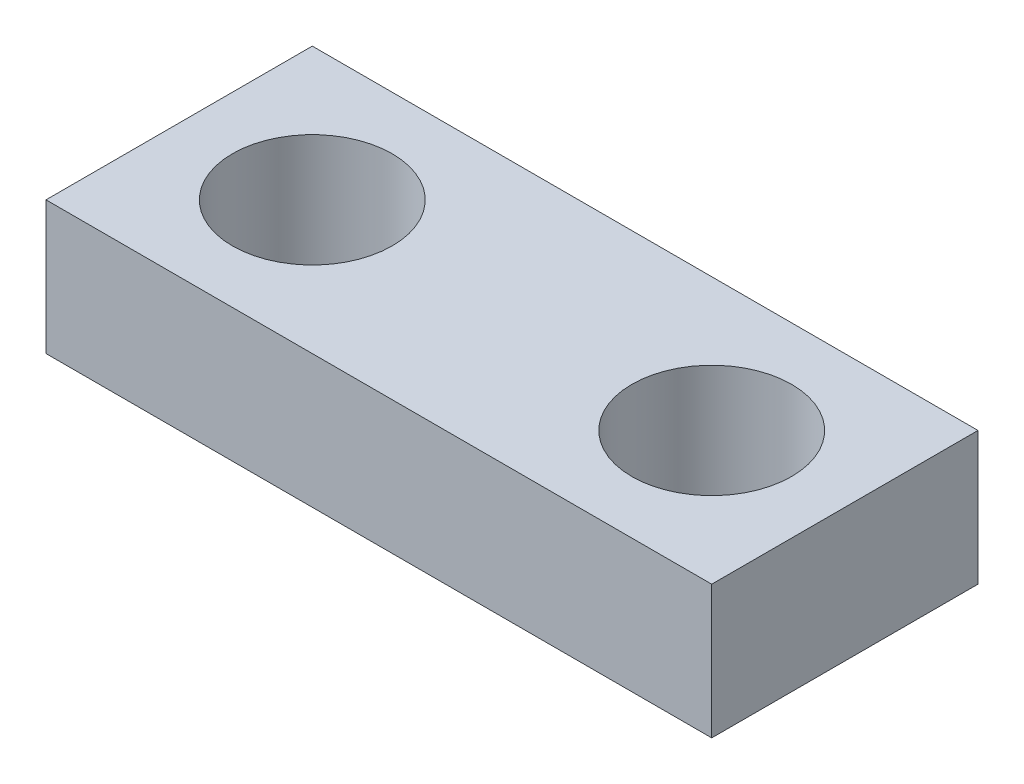
ISO-10303-21;
HEADER;
FILE_DESCRIPTION(('STEP AP214'),'2;1');
FILE_NAME('part.step','',(''),(''),'','','');
FILE_SCHEMA(('AUTOMOTIVE_DESIGN { 1 0 10303 214 1 1 1 1 }'));
ENDSEC;
DATA;
#1=APPLICATION_CONTEXT('core data for automotive mechanical design processes');
#2=APPLICATION_PROTOCOL_DEFINITION('international standard','automotive_design',2000,#1);
#3=PRODUCT_CONTEXT('',#1,'mechanical');
#4=PRODUCT('Part','Part','',(#3));
#5=PRODUCT_RELATED_PRODUCT_CATEGORY('part','',(#4));
#6=PRODUCT_DEFINITION_FORMATION('','',#4);
#7=PRODUCT_DEFINITION_CONTEXT('part definition',#1,'design');
#8=PRODUCT_DEFINITION('design','',#6,#7);
#9=PRODUCT_DEFINITION_SHAPE('','',#8);
#10=(LENGTH_UNIT() NAMED_UNIT(*) SI_UNIT(.MILLI.,.METRE.));
#11=(NAMED_UNIT(*) PLANE_ANGLE_UNIT() SI_UNIT($,.RADIAN.));
#12=(NAMED_UNIT(*) SI_UNIT($,.STERADIAN.) SOLID_ANGLE_UNIT());
#13=UNCERTAINTY_MEASURE_WITH_UNIT(LENGTH_MEASURE(1.E-05),#10,'distance_accuracy_value','');
#14=(GEOMETRIC_REPRESENTATION_CONTEXT(3) GLOBAL_UNCERTAINTY_ASSIGNED_CONTEXT((#13)) GLOBAL_UNIT_ASSIGNED_CONTEXT((#10,
#11,#12)) REPRESENTATION_CONTEXT('',''));
#15=CARTESIAN_POINT('',(0.,0.,0.));
#16=DIRECTION('',(0.,0.,1.));
#17=DIRECTION('',(1.,0.,0.));
#18=AXIS2_PLACEMENT_3D('',#15,#16,#17);
#19=CARTESIAN_POINT('',(0.,2.5,0.));
#20=DIRECTION('',(0.,-1.,0.));
#21=DIRECTION('',(0.,0.,-1.));
#22=AXIS2_PLACEMENT_3D('',#19,#20,#21);
#23=PLANE('',#22);
#24=DIRECTION('',(0.,0.,1.));
#25=VECTOR('',#24,1.);
#26=CARTESIAN_POINT('',(-12.5,2.5,-5.));
#27=LINE('',#26,#25);
#28=CARTESIAN_POINT('',(-12.5,2.5,-5.));
#29=VERTEX_POINT('',#28);
#30=CARTESIAN_POINT('',(-12.5,2.5,5.));
#31=VERTEX_POINT('',#30);
#32=EDGE_CURVE('E85',#29,#31,#27,.T.);
#33=ORIENTED_EDGE('',*,*,#32,.T.);
#34=DIRECTION('',(1.,0.,0.));
#35=VECTOR('',#34,1.);
#36=CARTESIAN_POINT('',(12.5,2.5,5.));
#37=LINE('',#36,#35);
#38=CARTESIAN_POINT('',(12.5,2.5,5.));
#39=VERTEX_POINT('',#38);
#40=EDGE_CURVE('E80',#31,#39,#37,.T.);
#41=ORIENTED_EDGE('',*,*,#40,.T.);
#42=DIRECTION('',(0.,0.,-1.));
#43=VECTOR('',#42,1.);
#44=CARTESIAN_POINT('',(12.5,2.5,-5.));
#45=LINE('',#44,#43);
#46=CARTESIAN_POINT('',(12.5,2.5,-5.));
#47=VERTEX_POINT('',#46);
#48=EDGE_CURVE('E83',#39,#47,#45,.T.);
#49=ORIENTED_EDGE('',*,*,#48,.T.);
#50=DIRECTION('',(-1.,0.,0.));
#51=VECTOR('',#50,1.);
#52=CARTESIAN_POINT('',(12.5,2.5,-5.));
#53=LINE('',#52,#51);
#54=EDGE_CURVE('E50',#47,#29,#53,.T.);
#55=ORIENTED_EDGE('',*,*,#54,.T.);
#56=EDGE_LOOP('',(#33,#41,#49,#55));
#57=FACE_BOUND('',#56,.T.);
#58=CARTESIAN_POINT('',(-7.50000000000001,2.5,0.));
#59=DIRECTION('',(0.,1.,0.));
#60=DIRECTION('',(0.,0.,1.));
#61=AXIS2_PLACEMENT_3D('',#58,#59,#60);
#62=CIRCLE('',#61,3.);
#63=CARTESIAN_POINT('',(-7.50000000000001,2.5,3.));
#64=VERTEX_POINT('',#63);
#65=EDGE_CURVE('E100',#64,#64,#62,.T.);
#66=ORIENTED_EDGE('',*,*,#65,.F.);
#67=EDGE_LOOP('',(#66));
#68=FACE_BOUND('',#67,.T.);
#69=CARTESIAN_POINT('',(7.49999999999999,2.5,0.));
#70=DIRECTION('',(0.,1.,0.));
#71=DIRECTION('',(0.,0.,1.));
#72=AXIS2_PLACEMENT_3D('',#69,#70,#71);
#73=CIRCLE('',#72,2.99999999999999);
#74=CARTESIAN_POINT('',(7.49999999999999,2.5,2.99999999999999));
#75=VERTEX_POINT('',#74);
#76=EDGE_CURVE('E115',#75,#75,#73,.T.);
#77=ORIENTED_EDGE('',*,*,#76,.F.);
#78=EDGE_LOOP('',(#77));
#79=FACE_BOUND('',#78,.T.);
#80=ADVANCED_FACE('F33',(#57,#68,#79),#23,.F.);
#81=CARTESIAN_POINT('',(0.,-2.5,0.));
#82=DIRECTION('',(0.,-1.,0.));
#83=DIRECTION('',(0.,0.,-1.));
#84=AXIS2_PLACEMENT_3D('',#81,#82,#83);
#85=PLANE('',#84);
#86=CARTESIAN_POINT('',(-7.50000000000001,-2.5,0.));
#87=DIRECTION('',(0.,1.,0.));
#88=DIRECTION('',(0.,0.,1.));
#89=AXIS2_PLACEMENT_3D('',#86,#87,#88);
#90=CIRCLE('',#89,3.);
#91=CARTESIAN_POINT('',(-7.50000000000001,-2.5,3.));
#92=VERTEX_POINT('',#91);
#93=EDGE_CURVE('E112',#92,#92,#90,.T.);
#94=ORIENTED_EDGE('',*,*,#93,.T.);
#95=EDGE_LOOP('',(#94));
#96=FACE_BOUND('',#95,.T.);
#97=DIRECTION('',(0.,0.,1.));
#98=VECTOR('',#97,1.);
#99=CARTESIAN_POINT('',(-12.5,-2.5,-5.));
#100=LINE('',#99,#98);
#101=CARTESIAN_POINT('',(-12.5,-2.5,-5.));
#102=VERTEX_POINT('',#101);
#103=CARTESIAN_POINT('',(-12.5,-2.5,5.));
#104=VERTEX_POINT('',#103);
#105=EDGE_CURVE('E97',#102,#104,#100,.T.);
#106=ORIENTED_EDGE('',*,*,#105,.F.);
#107=DIRECTION('',(-1.,0.,0.));
#108=VECTOR('',#107,1.);
#109=CARTESIAN_POINT('',(12.5,-2.5,-5.));
#110=LINE('',#109,#108);
#111=CARTESIAN_POINT('',(12.5,-2.5,-5.));
#112=VERTEX_POINT('',#111);
#113=EDGE_CURVE('E73',#112,#102,#110,.T.);
#114=ORIENTED_EDGE('',*,*,#113,.F.);
#115=DIRECTION('',(0.,0.,-1.));
#116=VECTOR('',#115,1.);
#117=CARTESIAN_POINT('',(12.5,-2.5,-5.));
#118=LINE('',#117,#116);
#119=CARTESIAN_POINT('',(12.5,-2.5,5.));
#120=VERTEX_POINT('',#119);
#121=EDGE_CURVE('E67',#120,#112,#118,.T.);
#122=ORIENTED_EDGE('',*,*,#121,.F.);
#123=DIRECTION('',(1.,0.,0.));
#124=VECTOR('',#123,1.);
#125=CARTESIAN_POINT('',(12.5,-2.5,5.));
#126=LINE('',#125,#124);
#127=EDGE_CURVE('E89',#104,#120,#126,.T.);
#128=ORIENTED_EDGE('',*,*,#127,.F.);
#129=EDGE_LOOP('',(#106,#114,#122,#128));
#130=FACE_BOUND('',#129,.T.);
#131=CARTESIAN_POINT('',(7.49999999999999,-2.5,0.));
#132=DIRECTION('',(0.,1.,0.));
#133=DIRECTION('',(0.,0.,1.));
#134=AXIS2_PLACEMENT_3D('',#131,#132,#133);
#135=CIRCLE('',#134,2.99999999999999);
#136=CARTESIAN_POINT('',(7.49999999999999,-2.5,2.99999999999999));
#137=VERTEX_POINT('',#136);
#138=EDGE_CURVE('E118',#137,#137,#135,.T.);
#139=ORIENTED_EDGE('',*,*,#138,.T.);
#140=EDGE_LOOP('',(#139));
#141=FACE_BOUND('',#140,.T.);
#142=ADVANCED_FACE('F108',(#96,#130,#141),#85,.T.);
#143=CARTESIAN_POINT('',(-12.5,2.5,-5.));
#144=DIRECTION('',(1.,0.,0.));
#145=DIRECTION('',(0.,0.,-1.));
#146=AXIS2_PLACEMENT_3D('',#143,#144,#145);
#147=PLANE('',#146);
#148=ORIENTED_EDGE('',*,*,#105,.T.);
#149=DIRECTION('',(0.,-1.,0.));
#150=VECTOR('',#149,1.);
#151=CARTESIAN_POINT('',(-12.5,2.5,5.));
#152=LINE('',#151,#150);
#153=EDGE_CURVE('E11',#31,#104,#152,.T.);
#154=ORIENTED_EDGE('',*,*,#153,.F.);
#155=ORIENTED_EDGE('',*,*,#32,.F.);
#156=DIRECTION('',(0.,-1.,0.));
#157=VECTOR('',#156,1.);
#158=CARTESIAN_POINT('',(-12.5,2.5,-5.));
#159=LINE('',#158,#157);
#160=EDGE_CURVE('E93',#29,#102,#159,.T.);
#161=ORIENTED_EDGE('',*,*,#160,.T.);
#162=EDGE_LOOP('',(#148,#154,#155,#161));
#163=FACE_BOUND('',#162,.T.);
#164=ADVANCED_FACE('F35',(#163),#147,.F.);
#165=CARTESIAN_POINT('',(12.5,2.5,5.));
#166=DIRECTION('',(0.,0.,-1.));
#167=DIRECTION('',(-1.,0.,0.));
#168=AXIS2_PLACEMENT_3D('',#165,#166,#167);
#169=PLANE('',#168);
#170=ORIENTED_EDGE('',*,*,#127,.T.);
#171=DIRECTION('',(0.,-1.,0.));
#172=VECTOR('',#171,1.);
#173=CARTESIAN_POINT('',(12.5,2.5,5.));
#174=LINE('',#173,#172);
#175=EDGE_CURVE('E42',#39,#120,#174,.T.);
#176=ORIENTED_EDGE('',*,*,#175,.F.);
#177=ORIENTED_EDGE('',*,*,#40,.F.);
#178=ORIENTED_EDGE('',*,*,#153,.T.);
#179=EDGE_LOOP('',(#170,#176,#177,#178));
#180=FACE_BOUND('',#179,.T.);
#181=ADVANCED_FACE('F88',(#180),#169,.F.);
#182=CARTESIAN_POINT('',(12.5,2.5,-5.));
#183=DIRECTION('',(-1.,0.,0.));
#184=DIRECTION('',(0.,0.,1.));
#185=AXIS2_PLACEMENT_3D('',#182,#183,#184);
#186=PLANE('',#185);
#187=ORIENTED_EDGE('',*,*,#121,.T.);
#188=DIRECTION('',(0.,-1.,0.));
#189=VECTOR('',#188,1.);
#190=CARTESIAN_POINT('',(12.5,2.5,-5.));
#191=LINE('',#190,#189);
#192=EDGE_CURVE('E90',#47,#112,#191,.T.);
#193=ORIENTED_EDGE('',*,*,#192,.F.);
#194=ORIENTED_EDGE('',*,*,#48,.F.);
#195=ORIENTED_EDGE('',*,*,#175,.T.);
#196=EDGE_LOOP('',(#187,#193,#194,#195));
#197=FACE_BOUND('',#196,.T.);
#198=ADVANCED_FACE('F91',(#197),#186,.F.);
#199=CARTESIAN_POINT('',(12.5,2.5,-5.));
#200=DIRECTION('',(0.,0.,1.));
#201=DIRECTION('',(1.,0.,0.));
#202=AXIS2_PLACEMENT_3D('',#199,#200,#201);
#203=PLANE('',#202);
#204=ORIENTED_EDGE('',*,*,#113,.T.);
#205=ORIENTED_EDGE('',*,*,#160,.F.);
#206=ORIENTED_EDGE('',*,*,#54,.F.);
#207=ORIENTED_EDGE('',*,*,#192,.T.);
#208=EDGE_LOOP('',(#204,#205,#206,#207));
#209=FACE_BOUND('',#208,.T.);
#210=ADVANCED_FACE('F105',(#209),#203,.F.);
#211=CARTESIAN_POINT('',(-7.50000000000001,2.5,0.));
#212=DIRECTION('',(0.,-1.,0.));
#213=DIRECTION('',(0.,0.,-1.));
#214=AXIS2_PLACEMENT_3D('',#211,#212,#213);
#215=CYLINDRICAL_SURFACE('',#214,3.);
#216=ORIENTED_EDGE('',*,*,#65,.T.);
#217=EDGE_LOOP('',(#216));
#218=FACE_BOUND('',#217,.T.);
#219=ORIENTED_EDGE('',*,*,#93,.F.);
#220=EDGE_LOOP('',(#219));
#221=FACE_BOUND('',#220,.T.);
#222=ADVANCED_FACE('F135',(#218,#221),#215,.F.);
#223=CARTESIAN_POINT('',(7.49999999999999,2.5,0.));
#224=DIRECTION('',(0.,-1.,0.));
#225=DIRECTION('',(0.,0.,-1.));
#226=AXIS2_PLACEMENT_3D('',#223,#224,#225);
#227=CYLINDRICAL_SURFACE('',#226,2.99999999999999);
#228=ORIENTED_EDGE('',*,*,#76,.T.);
#229=EDGE_LOOP('',(#228));
#230=FACE_BOUND('',#229,.T.);
#231=ORIENTED_EDGE('',*,*,#138,.F.);
#232=EDGE_LOOP('',(#231));
#233=FACE_BOUND('',#232,.T.);
#234=ADVANCED_FACE('F124',(#230,#233),#227,.F.);
#235=CLOSED_SHELL('',(#80,#142,#164,#181,#198,#210,#222,#234));
#236=MANIFOLD_SOLID_BREP('B2',#235);
#237=ADVANCED_BREP_SHAPE_REPRESENTATION('',(#18,#236),#14);
#238=SHAPE_DEFINITION_REPRESENTATION(#9,#237);
ENDSEC;
END-ISO-10303-21;
